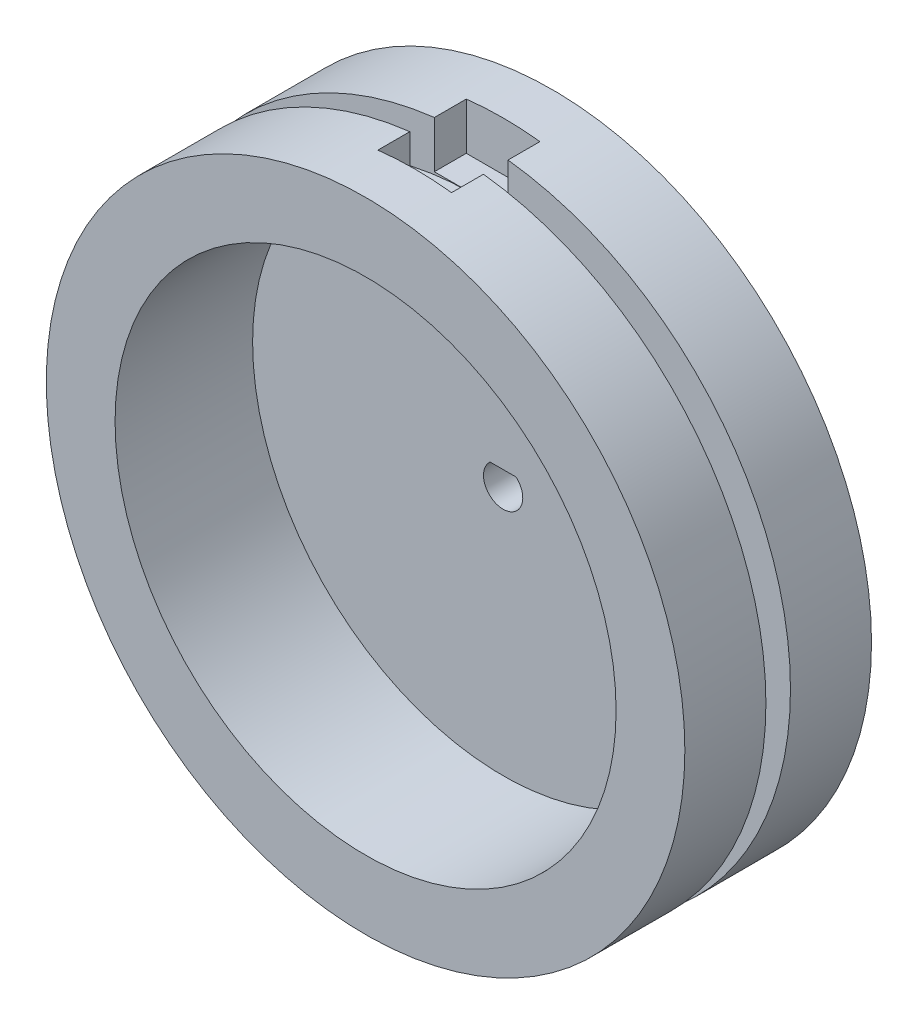
ISO-10303-21;
HEADER;
FILE_DESCRIPTION(('STEP AP214'),'2;1');
FILE_NAME('part.step','',(''),(''),'','','');
FILE_SCHEMA(('AUTOMOTIVE_DESIGN { 1 0 10303 214 1 1 1 1 }'));
ENDSEC;
DATA;
#1=APPLICATION_CONTEXT('core data for automotive mechanical design processes');
#2=APPLICATION_PROTOCOL_DEFINITION('international standard','automotive_design',2000,#1);
#3=PRODUCT_CONTEXT('',#1,'mechanical');
#4=PRODUCT('Part','Part','',(#3));
#5=PRODUCT_RELATED_PRODUCT_CATEGORY('part','',(#4));
#6=PRODUCT_DEFINITION_FORMATION('','',#4);
#7=PRODUCT_DEFINITION_CONTEXT('part definition',#1,'design');
#8=PRODUCT_DEFINITION('design','',#6,#7);
#9=PRODUCT_DEFINITION_SHAPE('','',#8);
#10=(LENGTH_UNIT() NAMED_UNIT(*) SI_UNIT(.MILLI.,.METRE.));
#11=(NAMED_UNIT(*) PLANE_ANGLE_UNIT() SI_UNIT($,.RADIAN.));
#12=(NAMED_UNIT(*) SI_UNIT($,.STERADIAN.) SOLID_ANGLE_UNIT());
#13=UNCERTAINTY_MEASURE_WITH_UNIT(LENGTH_MEASURE(1.E-05),#10,'distance_accuracy_value','');
#14=(GEOMETRIC_REPRESENTATION_CONTEXT(3) GLOBAL_UNCERTAINTY_ASSIGNED_CONTEXT((#13)) GLOBAL_UNIT_ASSIGNED_CONTEXT((#10,
#11,#12)) REPRESENTATION_CONTEXT('',''));
#15=CARTESIAN_POINT('',(0.,0.,0.));
#16=DIRECTION('',(0.,0.,1.));
#17=DIRECTION('',(1.,0.,0.));
#18=AXIS2_PLACEMENT_3D('',#15,#16,#17);
#19=CARTESIAN_POINT('',(0.,0.,5.));
#20=DIRECTION('',(0.,0.,1.));
#21=DIRECTION('',(1.,0.,0.));
#22=AXIS2_PLACEMENT_3D('',#19,#20,#21);
#23=CYLINDRICAL_SURFACE('',#22,32.5);
#24=CARTESIAN_POINT('',(0.,0.,0.));
#25=DIRECTION('',(0.,0.,1.));
#26=DIRECTION('',(1.,0.,0.));
#27=AXIS2_PLACEMENT_3D('',#24,#25,#26);
#28=CIRCLE('',#27,32.5);
#29=CARTESIAN_POINT('',(32.5,0.,0.));
#30=VERTEX_POINT('',#29);
#31=EDGE_CURVE('E304',#30,#30,#28,.T.);
#32=ORIENTED_EDGE('',*,*,#31,.T.);
#33=EDGE_LOOP('',(#32));
#34=FACE_BOUND('',#33,.T.);
#35=DIRECTION('',(0.,0.,1.));
#36=VECTOR('',#35,1.);
#37=CARTESIAN_POINT('',(-3.75,-32.2829289253624,5.));
#38=LINE('',#37,#36);
#39=CARTESIAN_POINT('',(-3.75,-32.2829289253624,8.25));
#40=VERTEX_POINT('',#39);
#41=CARTESIAN_POINT('',(-3.75,-32.2829289253624,5.));
#42=VERTEX_POINT('',#41);
#43=EDGE_CURVE('E226',#40,#42,#38,.F.);
#44=ORIENTED_EDGE('',*,*,#43,.F.);
#45=CARTESIAN_POINT('',(0.,0.,8.25));
#46=DIRECTION('',(0.,0.,1.));
#47=DIRECTION('',(1.,0.,0.));
#48=AXIS2_PLACEMENT_3D('',#45,#46,#47);
#49=CIRCLE('',#48,32.5);
#50=CARTESIAN_POINT('',(-3.75,32.2829289253624,8.25));
#51=VERTEX_POINT('',#50);
#52=EDGE_CURVE('E301',#51,#40,#49,.T.);
#53=ORIENTED_EDGE('',*,*,#52,.F.);
#54=DIRECTION('',(0.,0.,1.));
#55=VECTOR('',#54,1.);
#56=CARTESIAN_POINT('',(-3.75,32.2829289253624,5.));
#57=LINE('',#56,#55);
#58=CARTESIAN_POINT('',(-3.75,32.2829289253624,5.));
#59=VERTEX_POINT('',#58);
#60=EDGE_CURVE('E272',#51,#59,#57,.F.);
#61=ORIENTED_EDGE('',*,*,#60,.T.);
#62=CARTESIAN_POINT('',(0.,0.,5.));
#63=DIRECTION('',(0.,0.,-1.));
#64=DIRECTION('',(-1.,0.,0.));
#65=AXIS2_PLACEMENT_3D('',#62,#63,#64);
#66=CIRCLE('',#65,32.5);
#67=CARTESIAN_POINT('',(3.75,32.2829289253624,5.));
#68=VERTEX_POINT('',#67);
#69=EDGE_CURVE('E320',#59,#68,#66,.T.);
#70=ORIENTED_EDGE('',*,*,#69,.T.);
#71=DIRECTION('',(0.,0.,1.));
#72=VECTOR('',#71,1.);
#73=CARTESIAN_POINT('',(3.75,32.2829289253624,5.));
#74=LINE('',#73,#72);
#75=CARTESIAN_POINT('',(3.75,32.2829289253624,8.25));
#76=VERTEX_POINT('',#75);
#77=EDGE_CURVE('E263',#68,#76,#74,.T.);
#78=ORIENTED_EDGE('',*,*,#77,.T.);
#79=CARTESIAN_POINT('',(3.75,-32.2829289253624,8.25));
#80=VERTEX_POINT('',#79);
#81=EDGE_CURVE('E300',#80,#76,#49,.T.);
#82=ORIENTED_EDGE('',*,*,#81,.F.);
#83=DIRECTION('',(0.,0.,1.));
#84=VECTOR('',#83,1.);
#85=CARTESIAN_POINT('',(3.75,-32.2829289253624,5.));
#86=LINE('',#85,#84);
#87=CARTESIAN_POINT('',(3.75,-32.2829289253624,5.));
#88=VERTEX_POINT('',#87);
#89=EDGE_CURVE('E220',#88,#80,#86,.T.);
#90=ORIENTED_EDGE('',*,*,#89,.F.);
#91=CARTESIAN_POINT('',(0.,0.,5.));
#92=DIRECTION('',(0.,0.,1.));
#93=DIRECTION('',(1.,0.,0.));
#94=AXIS2_PLACEMENT_3D('',#91,#92,#93);
#95=CIRCLE('',#94,32.5);
#96=EDGE_CURVE('E334',#42,#88,#95,.T.);
#97=ORIENTED_EDGE('',*,*,#96,.F.);
#98=EDGE_LOOP('',(#44,#53,#61,#70,#78,#82,#90,#97));
#99=FACE_BOUND('',#98,.T.);
#100=ADVANCED_FACE('F43',(#34,#99),#23,.T.);
#101=CARTESIAN_POINT('',(0.,32.5,8.25));
#102=DIRECTION('',(0.,0.,-1.));
#103=DIRECTION('',(-1.,0.,0.));
#104=AXIS2_PLACEMENT_3D('',#101,#102,#103);
#105=PLANE('',#104);
#106=DIRECTION('',(0.,-1.,0.));
#107=VECTOR('',#106,1.);
#108=CARTESIAN_POINT('',(-3.75,32.5,8.25));
#109=LINE('',#108,#107);
#110=CARTESIAN_POINT('',(-3.75,-27.5,8.25));
#111=VERTEX_POINT('',#110);
#112=EDGE_CURVE('E224',#111,#40,#109,.T.);
#113=ORIENTED_EDGE('',*,*,#112,.F.);
#114=DIRECTION('',(1.,0.,0.));
#115=VECTOR('',#114,1.);
#116=CARTESIAN_POINT('',(0.,-27.5,8.25));
#117=LINE('',#116,#115);
#118=CARTESIAN_POINT('',(0.,-27.5,8.25));
#119=VERTEX_POINT('',#118);
#120=EDGE_CURVE('E232',#111,#119,#117,.T.);
#121=ORIENTED_EDGE('',*,*,#120,.T.);
#122=CARTESIAN_POINT('',(0.,0.,8.25));
#123=DIRECTION('',(0.,0.,1.));
#124=DIRECTION('',(1.,0.,0.));
#125=AXIS2_PLACEMENT_3D('',#122,#123,#124);
#126=CIRCLE('',#125,27.5);
#127=CARTESIAN_POINT('',(0.,27.5,8.25));
#128=VERTEX_POINT('',#127);
#129=EDGE_CURVE('E297',#128,#119,#126,.T.);
#130=ORIENTED_EDGE('',*,*,#129,.F.);
#131=DIRECTION('',(-1.,0.,0.));
#132=VECTOR('',#131,1.);
#133=CARTESIAN_POINT('',(0.,27.5,8.25));
#134=LINE('',#133,#132);
#135=CARTESIAN_POINT('',(-3.75,27.5,8.25));
#136=VERTEX_POINT('',#135);
#137=EDGE_CURVE('E275',#128,#136,#134,.T.);
#138=ORIENTED_EDGE('',*,*,#137,.T.);
#139=DIRECTION('',(0.,1.,0.));
#140=VECTOR('',#139,1.);
#141=CARTESIAN_POINT('',(-3.75,32.5,8.25));
#142=LINE('',#141,#140);
#143=EDGE_CURVE('E269',#136,#51,#142,.T.);
#144=ORIENTED_EDGE('',*,*,#143,.T.);
#145=ORIENTED_EDGE('',*,*,#52,.T.);
#146=EDGE_LOOP('',(#113,#121,#130,#138,#144,#145));
#147=FACE_BOUND('',#146,.T.);
#148=ADVANCED_FACE('F412',(#147),#105,.F.);
#149=DIRECTION('',(0.,1.,0.));
#150=VECTOR('',#149,1.);
#151=CARTESIAN_POINT('',(3.75,32.5,8.25));
#152=LINE('',#151,#150);
#153=CARTESIAN_POINT('',(3.75,-27.5,8.25));
#154=VERTEX_POINT('',#153);
#155=EDGE_CURVE('E217',#80,#154,#152,.T.);
#156=ORIENTED_EDGE('',*,*,#155,.F.);
#157=ORIENTED_EDGE('',*,*,#81,.T.);
#158=DIRECTION('',(0.,-1.,0.));
#159=VECTOR('',#158,1.);
#160=CARTESIAN_POINT('',(3.75,32.5,8.25));
#161=LINE('',#160,#159);
#162=CARTESIAN_POINT('',(3.75,27.5,8.25));
#163=VERTEX_POINT('',#162);
#164=EDGE_CURVE('E260',#76,#163,#161,.T.);
#165=ORIENTED_EDGE('',*,*,#164,.T.);
#166=EDGE_CURVE('E278',#163,#128,#134,.T.);
#167=ORIENTED_EDGE('',*,*,#166,.T.);
#168=EDGE_CURVE('E296',#119,#128,#126,.T.);
#169=ORIENTED_EDGE('',*,*,#168,.F.);
#170=EDGE_CURVE('E229',#119,#154,#117,.T.);
#171=ORIENTED_EDGE('',*,*,#170,.T.);
#172=EDGE_LOOP('',(#156,#157,#165,#167,#169,#171));
#173=FACE_BOUND('',#172,.T.);
#174=ADVANCED_FACE('F418',(#173),#105,.F.);
#175=CARTESIAN_POINT('',(0.,27.5,10.75));
#176=DIRECTION('',(0.,0.,1.));
#177=DIRECTION('',(1.,0.,0.));
#178=AXIS2_PLACEMENT_3D('',#175,#176,#177);
#179=PLANE('',#178);
#180=DIRECTION('',(0.,1.,0.));
#181=VECTOR('',#180,1.);
#182=CARTESIAN_POINT('',(-3.75,27.5,10.75));
#183=LINE('',#182,#181);
#184=CARTESIAN_POINT('',(-3.75,-32.2829289253624,10.75));
#185=VERTEX_POINT('',#184);
#186=CARTESIAN_POINT('',(-3.75,-27.5,10.75));
#187=VERTEX_POINT('',#186);
#188=EDGE_CURVE('E222',#185,#187,#183,.T.);
#189=ORIENTED_EDGE('',*,*,#188,.F.);
#190=CARTESIAN_POINT('',(0.,0.,10.75));
#191=DIRECTION('',(0.,0.,1.));
#192=DIRECTION('',(1.,0.,0.));
#193=AXIS2_PLACEMENT_3D('',#190,#191,#192);
#194=CIRCLE('',#193,32.5);
#195=CARTESIAN_POINT('',(-3.75,32.2829289253624,10.75));
#196=VERTEX_POINT('',#195);
#197=EDGE_CURVE('E289',#196,#185,#194,.T.);
#198=ORIENTED_EDGE('',*,*,#197,.F.);
#199=DIRECTION('',(0.,-1.,0.));
#200=VECTOR('',#199,1.);
#201=CARTESIAN_POINT('',(-3.75,27.5,10.75));
#202=LINE('',#201,#200);
#203=CARTESIAN_POINT('',(-3.75,27.5,10.75));
#204=VERTEX_POINT('',#203);
#205=EDGE_CURVE('E266',#196,#204,#202,.T.);
#206=ORIENTED_EDGE('',*,*,#205,.T.);
#207=DIRECTION('',(1.,0.,0.));
#208=VECTOR('',#207,1.);
#209=CARTESIAN_POINT('',(0.,27.5,10.75));
#210=LINE('',#209,#208);
#211=CARTESIAN_POINT('',(0.,27.5,10.75));
#212=VERTEX_POINT('',#211);
#213=EDGE_CURVE('E319',#204,#212,#210,.T.);
#214=ORIENTED_EDGE('',*,*,#213,.T.);
#215=CARTESIAN_POINT('',(0.,0.,10.75));
#216=DIRECTION('',(0.,0.,1.));
#217=DIRECTION('',(1.,0.,0.));
#218=AXIS2_PLACEMENT_3D('',#215,#216,#217);
#219=CIRCLE('',#218,27.5);
#220=CARTESIAN_POINT('',(0.,-27.5,10.75));
#221=VERTEX_POINT('',#220);
#222=EDGE_CURVE('E293',#212,#221,#219,.T.);
#223=ORIENTED_EDGE('',*,*,#222,.T.);
#224=DIRECTION('',(-1.,0.,0.));
#225=VECTOR('',#224,1.);
#226=CARTESIAN_POINT('',(0.,-27.5,10.75));
#227=LINE('',#226,#225);
#228=EDGE_CURVE('E330',#221,#187,#227,.T.);
#229=ORIENTED_EDGE('',*,*,#228,.T.);
#230=EDGE_LOOP('',(#189,#198,#206,#214,#223,#229));
#231=FACE_BOUND('',#230,.T.);
#232=ADVANCED_FACE('F391',(#231),#179,.F.);
#233=DIRECTION('',(0.,-1.,0.));
#234=VECTOR('',#233,1.);
#235=CARTESIAN_POINT('',(3.75,27.5,10.75));
#236=LINE('',#235,#234);
#237=CARTESIAN_POINT('',(3.75,-27.5,10.75));
#238=VERTEX_POINT('',#237);
#239=CARTESIAN_POINT('',(3.75,-32.2829289253624,10.75));
#240=VERTEX_POINT('',#239);
#241=EDGE_CURVE('E207',#238,#240,#236,.T.);
#242=ORIENTED_EDGE('',*,*,#241,.F.);
#243=EDGE_CURVE('E333',#238,#221,#227,.T.);
#244=ORIENTED_EDGE('',*,*,#243,.T.);
#245=EDGE_CURVE('E292',#221,#212,#219,.T.);
#246=ORIENTED_EDGE('',*,*,#245,.T.);
#247=CARTESIAN_POINT('',(3.75,27.5,10.75));
#248=VERTEX_POINT('',#247);
#249=EDGE_CURVE('E316',#212,#248,#210,.T.);
#250=ORIENTED_EDGE('',*,*,#249,.T.);
#251=DIRECTION('',(0.,1.,0.));
#252=VECTOR('',#251,1.);
#253=CARTESIAN_POINT('',(3.75,27.5,10.75));
#254=LINE('',#253,#252);
#255=CARTESIAN_POINT('',(3.75,32.2829289253624,10.75));
#256=VERTEX_POINT('',#255);
#257=EDGE_CURVE('E250',#248,#256,#254,.T.);
#258=ORIENTED_EDGE('',*,*,#257,.T.);
#259=EDGE_CURVE('E288',#240,#256,#194,.T.);
#260=ORIENTED_EDGE('',*,*,#259,.F.);
#261=EDGE_LOOP('',(#242,#244,#246,#250,#258,#260));
#262=FACE_BOUND('',#261,.T.);
#263=ADVANCED_FACE('F359',(#262),#179,.F.);
#264=CARTESIAN_POINT('',(0.,0.,5.));
#265=DIRECTION('',(0.,0.,1.));
#266=DIRECTION('',(1.,0.,0.));
#267=AXIS2_PLACEMENT_3D('',#264,#265,#266);
#268=CYLINDRICAL_SURFACE('',#267,32.5);
#269=CARTESIAN_POINT('',(0.,0.,19.));
#270=DIRECTION('',(0.,0.,1.));
#271=DIRECTION('',(1.,0.,0.));
#272=AXIS2_PLACEMENT_3D('',#269,#270,#271);
#273=CIRCLE('',#272,32.5);
#274=CARTESIAN_POINT('',(32.5,0.,19.));
#275=VERTEX_POINT('',#274);
#276=EDGE_CURVE('E285',#275,#275,#273,.T.);
#277=ORIENTED_EDGE('',*,*,#276,.F.);
#278=EDGE_LOOP('',(#277));
#279=FACE_BOUND('',#278,.T.);
#280=CARTESIAN_POINT('',(0.,0.,14.));
#281=DIRECTION('',(0.,0.,-1.));
#282=DIRECTION('',(-1.,0.,0.));
#283=AXIS2_PLACEMENT_3D('',#280,#281,#282);
#284=CIRCLE('',#283,32.5);
#285=CARTESIAN_POINT('',(3.75,-32.2829289253624,14.));
#286=VERTEX_POINT('',#285);
#287=CARTESIAN_POINT('',(-3.75,-32.2829289253624,14.));
#288=VERTEX_POINT('',#287);
#289=EDGE_CURVE('E323',#286,#288,#284,.T.);
#290=ORIENTED_EDGE('',*,*,#289,.F.);
#291=DIRECTION('',(0.,0.,1.));
#292=VECTOR('',#291,1.);
#293=CARTESIAN_POINT('',(3.75,-32.2829289253624,5.));
#294=LINE('',#293,#292);
#295=EDGE_CURVE('E327',#240,#286,#294,.T.);
#296=ORIENTED_EDGE('',*,*,#295,.F.);
#297=ORIENTED_EDGE('',*,*,#259,.T.);
#298=DIRECTION('',(0.,0.,1.));
#299=VECTOR('',#298,1.);
#300=CARTESIAN_POINT('',(3.75,32.2829289253624,5.));
#301=LINE('',#300,#299);
#302=CARTESIAN_POINT('',(3.75,32.2829289253624,14.));
#303=VERTEX_POINT('',#302);
#304=EDGE_CURVE('E313',#256,#303,#301,.T.);
#305=ORIENTED_EDGE('',*,*,#304,.T.);
#306=CARTESIAN_POINT('',(0.,0.,14.));
#307=DIRECTION('',(0.,0.,1.));
#308=DIRECTION('',(1.,0.,0.));
#309=AXIS2_PLACEMENT_3D('',#306,#307,#308);
#310=CIRCLE('',#309,32.5);
#311=CARTESIAN_POINT('',(-3.75,32.2829289253624,14.));
#312=VERTEX_POINT('',#311);
#313=EDGE_CURVE('E307',#303,#312,#310,.T.);
#314=ORIENTED_EDGE('',*,*,#313,.T.);
#315=DIRECTION('',(0.,0.,1.));
#316=VECTOR('',#315,1.);
#317=CARTESIAN_POINT('',(-3.75,32.2829289253624,5.));
#318=LINE('',#317,#316);
#319=EDGE_CURVE('E310',#312,#196,#318,.F.);
#320=ORIENTED_EDGE('',*,*,#319,.T.);
#321=ORIENTED_EDGE('',*,*,#197,.T.);
#322=DIRECTION('',(0.,0.,1.));
#323=VECTOR('',#322,1.);
#324=CARTESIAN_POINT('',(-3.75,-32.2829289253624,5.));
#325=LINE('',#324,#323);
#326=EDGE_CURVE('E325',#288,#185,#325,.F.);
#327=ORIENTED_EDGE('',*,*,#326,.F.);
#328=EDGE_LOOP('',(#290,#296,#297,#305,#314,#320,#321,#327));
#329=FACE_BOUND('',#328,.T.);
#330=ADVANCED_FACE('F356',(#279,#329),#268,.T.);
#331=CARTESIAN_POINT('',(0.,0.,0.));
#332=DIRECTION('',(0.,0.,1.));
#333=DIRECTION('',(1.,0.,0.));
#334=AXIS2_PLACEMENT_3D('',#331,#332,#333);
#335=PLANE('',#334);
#336=DIRECTION('',(1.,0.,0.));
#337=VECTOR('',#336,1.);
#338=CARTESIAN_POINT('',(1.3228756555323,1.5,0.));
#339=LINE('',#338,#337);
#340=CARTESIAN_POINT('',(-1.3228756555323,1.5,0.));
#341=VERTEX_POINT('',#340);
#342=CARTESIAN_POINT('',(1.3228756555323,1.5,0.));
#343=VERTEX_POINT('',#342);
#344=EDGE_CURVE('E184',#341,#343,#339,.T.);
#345=ORIENTED_EDGE('',*,*,#344,.F.);
#346=CARTESIAN_POINT('',(0.,0.,0.));
#347=DIRECTION('',(0.,0.,-1.));
#348=DIRECTION('',(-1.,0.,0.));
#349=AXIS2_PLACEMENT_3D('',#346,#347,#348);
#350=CIRCLE('',#349,2.);
#351=EDGE_CURVE('E58',#343,#341,#350,.T.);
#352=ORIENTED_EDGE('',*,*,#351,.F.);
#353=EDGE_LOOP('',(#345,#352));
#354=FACE_BOUND('',#353,.T.);
#355=ORIENTED_EDGE('',*,*,#31,.F.);
#356=EDGE_LOOP('',(#355));
#357=FACE_BOUND('',#356,.T.);
#358=ADVANCED_FACE('F45',(#354,#357),#335,.F.);
#359=CARTESIAN_POINT('',(0.,0.,5.));
#360=DIRECTION('',(0.,0.,1.));
#361=DIRECTION('',(1.,0.,0.));
#362=AXIS2_PLACEMENT_3D('',#359,#360,#361);
#363=CYLINDRICAL_SURFACE('',#362,27.5);
#364=ORIENTED_EDGE('',*,*,#245,.F.);
#365=ORIENTED_EDGE('',*,*,#222,.F.);
#366=EDGE_LOOP('',(#364,#365));
#367=FACE_BOUND('',#366,.T.);
#368=ORIENTED_EDGE('',*,*,#129,.T.);
#369=ORIENTED_EDGE('',*,*,#168,.T.);
#370=EDGE_LOOP('',(#368,#369));
#371=FACE_BOUND('',#370,.T.);
#372=ADVANCED_FACE('F352',(#367,#371),#363,.T.);
#373=CARTESIAN_POINT('',(0.,32.5,19.));
#374=DIRECTION('',(0.,0.,-1.));
#375=DIRECTION('',(-1.,0.,0.));
#376=AXIS2_PLACEMENT_3D('',#373,#374,#375);
#377=PLANE('',#376);
#378=CARTESIAN_POINT('',(0.,0.,19.));
#379=DIRECTION('',(0.,0.,1.));
#380=DIRECTION('',(1.,0.,0.));
#381=AXIS2_PLACEMENT_3D('',#378,#379,#380);
#382=CIRCLE('',#381,25.5);
#383=CARTESIAN_POINT('',(25.5,0.,19.));
#384=VERTEX_POINT('',#383);
#385=EDGE_CURVE('E282',#384,#384,#382,.T.);
#386=ORIENTED_EDGE('',*,*,#385,.F.);
#387=EDGE_LOOP('',(#386));
#388=FACE_BOUND('',#387,.T.);
#389=ORIENTED_EDGE('',*,*,#276,.T.);
#390=EDGE_LOOP('',(#389));
#391=FACE_BOUND('',#390,.T.);
#392=ADVANCED_FACE('F346',(#388,#391),#377,.F.);
#393=CARTESIAN_POINT('',(0.,0.,5.));
#394=DIRECTION('',(0.,0.,1.));
#395=DIRECTION('',(1.,0.,0.));
#396=AXIS2_PLACEMENT_3D('',#393,#394,#395);
#397=CYLINDRICAL_SURFACE('',#396,25.5);
#398=CARTESIAN_POINT('',(0.,0.,5.));
#399=DIRECTION('',(0.,0.,1.));
#400=DIRECTION('',(1.,0.,0.));
#401=AXIS2_PLACEMENT_3D('',#398,#399,#400);
#402=CIRCLE('',#401,25.5);
#403=CARTESIAN_POINT('',(25.5,0.,5.));
#404=VERTEX_POINT('',#403);
#405=EDGE_CURVE('E279',#404,#404,#402,.T.);
#406=ORIENTED_EDGE('',*,*,#405,.F.);
#407=EDGE_LOOP('',(#406));
#408=FACE_BOUND('',#407,.T.);
#409=ORIENTED_EDGE('',*,*,#385,.T.);
#410=EDGE_LOOP('',(#409));
#411=FACE_BOUND('',#410,.T.);
#412=ADVANCED_FACE('F340',(#408,#411),#397,.F.);
#413=CARTESIAN_POINT('',(0.,25.5,5.));
#414=DIRECTION('',(0.,0.,-1.));
#415=DIRECTION('',(-1.,0.,0.));
#416=AXIS2_PLACEMENT_3D('',#413,#414,#415);
#417=PLANE('',#416);
#418=DIRECTION('',(1.,0.,0.));
#419=VECTOR('',#418,1.);
#420=CARTESIAN_POINT('',(0.,1.5,5.));
#421=LINE('',#420,#419);
#422=CARTESIAN_POINT('',(-1.3228756555323,1.5,5.));
#423=VERTEX_POINT('',#422);
#424=CARTESIAN_POINT('',(1.3228756555323,1.5,5.));
#425=VERTEX_POINT('',#424);
#426=EDGE_CURVE('E51',#423,#425,#421,.T.);
#427=ORIENTED_EDGE('',*,*,#426,.T.);
#428=CARTESIAN_POINT('',(0.,0.,5.));
#429=DIRECTION('',(0.,0.,-1.));
#430=DIRECTION('',(-1.,0.,0.));
#431=AXIS2_PLACEMENT_3D('',#428,#429,#430);
#432=CIRCLE('',#431,2.);
#433=EDGE_CURVE('E11',#425,#423,#432,.T.);
#434=ORIENTED_EDGE('',*,*,#433,.T.);
#435=EDGE_LOOP('',(#427,#434));
#436=FACE_BOUND('',#435,.T.);
#437=ORIENTED_EDGE('',*,*,#405,.T.);
#438=EDGE_LOOP('',(#437));
#439=FACE_BOUND('',#438,.T.);
#440=ADVANCED_FACE('F336',(#436,#439),#417,.F.);
#441=CARTESIAN_POINT('',(-3.75,27.5,14.));
#442=DIRECTION('',(0.,0.,1.));
#443=DIRECTION('',(1.,0.,0.));
#444=AXIS2_PLACEMENT_3D('',#441,#442,#443);
#445=PLANE('',#444);
#446=DIRECTION('',(0.,1.,0.));
#447=VECTOR('',#446,1.);
#448=CARTESIAN_POINT('',(3.75,27.5,14.));
#449=LINE('',#448,#447);
#450=CARTESIAN_POINT('',(3.75,27.5,14.));
#451=VERTEX_POINT('',#450);
#452=EDGE_CURVE('E254',#451,#303,#449,.T.);
#453=ORIENTED_EDGE('',*,*,#452,.F.);
#454=DIRECTION('',(1.,0.,0.));
#455=VECTOR('',#454,1.);
#456=CARTESIAN_POINT('',(-3.75,27.5,14.));
#457=LINE('',#456,#455);
#458=CARTESIAN_POINT('',(-3.75,27.5,14.));
#459=VERTEX_POINT('',#458);
#460=EDGE_CURVE('E235',#459,#451,#457,.T.);
#461=ORIENTED_EDGE('',*,*,#460,.F.);
#462=DIRECTION('',(0.,1.,0.));
#463=VECTOR('',#462,1.);
#464=CARTESIAN_POINT('',(-3.75,27.5,14.));
#465=LINE('',#464,#463);
#466=EDGE_CURVE('E246',#459,#312,#465,.T.);
#467=ORIENTED_EDGE('',*,*,#466,.T.);
#468=ORIENTED_EDGE('',*,*,#313,.F.);
#469=EDGE_LOOP('',(#453,#461,#467,#468));
#470=FACE_BOUND('',#469,.T.);
#471=ADVANCED_FACE('F339',(#470),#445,.F.);
#472=CARTESIAN_POINT('',(3.75,27.5,14.));
#473=DIRECTION('',(1.,0.,0.));
#474=DIRECTION('',(0.,0.,-1.));
#475=AXIS2_PLACEMENT_3D('',#472,#473,#474);
#476=PLANE('',#475);
#477=DIRECTION('',(0.,0.,-1.));
#478=VECTOR('',#477,1.);
#479=CARTESIAN_POINT('',(3.75,27.5,14.));
#480=LINE('',#479,#478);
#481=EDGE_CURVE('E240',#451,#248,#480,.T.);
#482=ORIENTED_EDGE('',*,*,#481,.F.);
#483=ORIENTED_EDGE('',*,*,#452,.T.);
#484=ORIENTED_EDGE('',*,*,#304,.F.);
#485=ORIENTED_EDGE('',*,*,#257,.F.);
#486=EDGE_LOOP('',(#482,#483,#484,#485));
#487=FACE_BOUND('',#486,.T.);
#488=ADVANCED_FACE('F382',(#487),#476,.F.);
#489=CARTESIAN_POINT('',(-3.75,27.5,14.));
#490=DIRECTION('',(-1.,0.,0.));
#491=DIRECTION('',(0.,0.,1.));
#492=AXIS2_PLACEMENT_3D('',#489,#490,#491);
#493=PLANE('',#492);
#494=ORIENTED_EDGE('',*,*,#319,.F.);
#495=ORIENTED_EDGE('',*,*,#466,.F.);
#496=DIRECTION('',(0.,0.,1.));
#497=VECTOR('',#496,1.);
#498=CARTESIAN_POINT('',(-3.75,27.5,14.));
#499=LINE('',#498,#497);
#500=EDGE_CURVE('E236',#204,#459,#499,.T.);
#501=ORIENTED_EDGE('',*,*,#500,.F.);
#502=ORIENTED_EDGE('',*,*,#205,.F.);
#503=EDGE_LOOP('',(#494,#495,#501,#502));
#504=FACE_BOUND('',#503,.T.);
#505=ADVANCED_FACE('F434',(#504),#493,.F.);
#506=CARTESIAN_POINT('',(0.,27.5,0.));
#507=DIRECTION('',(0.,-1.,0.));
#508=DIRECTION('',(0.,0.,-1.));
#509=AXIS2_PLACEMENT_3D('',#506,#507,#508);
#510=PLANE('',#509);
#511=ORIENTED_EDGE('',*,*,#500,.T.);
#512=ORIENTED_EDGE('',*,*,#460,.T.);
#513=ORIENTED_EDGE('',*,*,#481,.T.);
#514=ORIENTED_EDGE('',*,*,#249,.F.);
#515=ORIENTED_EDGE('',*,*,#213,.F.);
#516=EDGE_LOOP('',(#511,#512,#513,#514,#515));
#517=FACE_BOUND('',#516,.T.);
#518=ADVANCED_FACE('F441',(#517),#510,.F.);
#519=CARTESIAN_POINT('',(-3.75,27.5,5.));
#520=DIRECTION('',(0.,0.,-1.));
#521=DIRECTION('',(-1.,0.,0.));
#522=AXIS2_PLACEMENT_3D('',#519,#520,#521);
#523=PLANE('',#522);
#524=DIRECTION('',(0.,1.,0.));
#525=VECTOR('',#524,1.);
#526=CARTESIAN_POINT('',(-3.75,27.5,5.));
#527=LINE('',#526,#525);
#528=CARTESIAN_POINT('',(-3.75,27.5,5.));
#529=VERTEX_POINT('',#528);
#530=EDGE_CURVE('E247',#529,#59,#527,.T.);
#531=ORIENTED_EDGE('',*,*,#530,.F.);
#532=DIRECTION('',(-1.,0.,0.));
#533=VECTOR('',#532,1.);
#534=CARTESIAN_POINT('',(-3.75,27.5,5.));
#535=LINE('',#534,#533);
#536=CARTESIAN_POINT('',(3.75,27.5,5.));
#537=VERTEX_POINT('',#536);
#538=EDGE_CURVE('E243',#537,#529,#535,.T.);
#539=ORIENTED_EDGE('',*,*,#538,.F.);
#540=DIRECTION('',(0.,1.,0.));
#541=VECTOR('',#540,1.);
#542=CARTESIAN_POINT('',(3.75,27.5,5.));
#543=LINE('',#542,#541);
#544=EDGE_CURVE('E251',#537,#68,#543,.T.);
#545=ORIENTED_EDGE('',*,*,#544,.T.);
#546=ORIENTED_EDGE('',*,*,#69,.F.);
#547=EDGE_LOOP('',(#531,#539,#545,#546));
#548=FACE_BOUND('',#547,.T.);
#549=ADVANCED_FACE('F439',(#548),#523,.F.);
#550=EDGE_CURVE('E239',#163,#537,#480,.T.);
#551=ORIENTED_EDGE('',*,*,#550,.T.);
#552=ORIENTED_EDGE('',*,*,#538,.T.);
#553=EDGE_CURVE('E233',#529,#136,#499,.T.);
#554=ORIENTED_EDGE('',*,*,#553,.T.);
#555=ORIENTED_EDGE('',*,*,#137,.F.);
#556=ORIENTED_EDGE('',*,*,#166,.F.);
#557=EDGE_LOOP('',(#551,#552,#554,#555,#556));
#558=FACE_BOUND('',#557,.T.);
#559=ADVANCED_FACE('F432',(#558),#510,.F.);
#560=ORIENTED_EDGE('',*,*,#143,.F.);
#561=ORIENTED_EDGE('',*,*,#553,.F.);
#562=ORIENTED_EDGE('',*,*,#530,.T.);
#563=ORIENTED_EDGE('',*,*,#60,.F.);
#564=EDGE_LOOP('',(#560,#561,#562,#563));
#565=FACE_BOUND('',#564,.T.);
#566=ADVANCED_FACE('F428',(#565),#493,.F.);
#567=ORIENTED_EDGE('',*,*,#544,.F.);
#568=ORIENTED_EDGE('',*,*,#550,.F.);
#569=ORIENTED_EDGE('',*,*,#164,.F.);
#570=ORIENTED_EDGE('',*,*,#77,.F.);
#571=EDGE_LOOP('',(#567,#568,#569,#570));
#572=FACE_BOUND('',#571,.T.);
#573=ADVANCED_FACE('F431',(#572),#476,.F.);
#574=CARTESIAN_POINT('',(3.75,-27.5,14.));
#575=DIRECTION('',(-1.,0.,0.));
#576=DIRECTION('',(0.,0.,1.));
#577=AXIS2_PLACEMENT_3D('',#574,#575,#576);
#578=PLANE('',#577);
#579=ORIENTED_EDGE('',*,*,#241,.T.);
#580=ORIENTED_EDGE('',*,*,#295,.T.);
#581=DIRECTION('',(0.,-1.,0.));
#582=VECTOR('',#581,1.);
#583=CARTESIAN_POINT('',(3.75,-27.5,14.));
#584=LINE('',#583,#582);
#585=CARTESIAN_POINT('',(3.75,-27.5,14.));
#586=VERTEX_POINT('',#585);
#587=EDGE_CURVE('E208',#586,#286,#584,.T.);
#588=ORIENTED_EDGE('',*,*,#587,.F.);
#589=DIRECTION('',(0.,0.,-1.));
#590=VECTOR('',#589,1.);
#591=CARTESIAN_POINT('',(3.75,-27.5,14.));
#592=LINE('',#591,#590);
#593=EDGE_CURVE('E198',#586,#238,#592,.T.);
#594=ORIENTED_EDGE('',*,*,#593,.T.);
#595=EDGE_LOOP('',(#579,#580,#588,#594));
#596=FACE_BOUND('',#595,.T.);
#597=ADVANCED_FACE('F368',(#596),#578,.T.);
#598=CARTESIAN_POINT('',(-3.75,-27.5,14.));
#599=DIRECTION('',(0.,0.,-1.));
#600=DIRECTION('',(-1.,0.,0.));
#601=AXIS2_PLACEMENT_3D('',#598,#599,#600);
#602=PLANE('',#601);
#603=ORIENTED_EDGE('',*,*,#587,.T.);
#604=ORIENTED_EDGE('',*,*,#289,.T.);
#605=DIRECTION('',(0.,-1.,0.));
#606=VECTOR('',#605,1.);
#607=CARTESIAN_POINT('',(-3.75,-27.5,14.));
#608=LINE('',#607,#606);
#609=CARTESIAN_POINT('',(-3.75,-27.5,14.));
#610=VERTEX_POINT('',#609);
#611=EDGE_CURVE('E204',#610,#288,#608,.T.);
#612=ORIENTED_EDGE('',*,*,#611,.F.);
#613=DIRECTION('',(1.,0.,0.));
#614=VECTOR('',#613,1.);
#615=CARTESIAN_POINT('',(-3.75,-27.5,14.));
#616=LINE('',#615,#614);
#617=EDGE_CURVE('E201',#610,#586,#616,.T.);
#618=ORIENTED_EDGE('',*,*,#617,.T.);
#619=EDGE_LOOP('',(#603,#604,#612,#618));
#620=FACE_BOUND('',#619,.T.);
#621=ADVANCED_FACE('F371',(#620),#602,.T.);
#622=CARTESIAN_POINT('',(-3.75,-27.5,14.));
#623=DIRECTION('',(1.,0.,0.));
#624=DIRECTION('',(0.,0.,-1.));
#625=AXIS2_PLACEMENT_3D('',#622,#623,#624);
#626=PLANE('',#625);
#627=ORIENTED_EDGE('',*,*,#188,.T.);
#628=DIRECTION('',(0.,0.,1.));
#629=VECTOR('',#628,1.);
#630=CARTESIAN_POINT('',(-3.75,-27.5,14.));
#631=LINE('',#630,#629);
#632=EDGE_CURVE('E180',#187,#610,#631,.T.);
#633=ORIENTED_EDGE('',*,*,#632,.T.);
#634=ORIENTED_EDGE('',*,*,#611,.T.);
#635=ORIENTED_EDGE('',*,*,#326,.T.);
#636=EDGE_LOOP('',(#627,#633,#634,#635));
#637=FACE_BOUND('',#636,.T.);
#638=ADVANCED_FACE('F394',(#637),#626,.T.);
#639=CARTESIAN_POINT('',(0.,-27.5,0.));
#640=DIRECTION('',(0.,1.,0.));
#641=DIRECTION('',(0.,0.,-1.));
#642=AXIS2_PLACEMENT_3D('',#639,#640,#641);
#643=PLANE('',#642);
#644=ORIENTED_EDGE('',*,*,#593,.F.);
#645=ORIENTED_EDGE('',*,*,#617,.F.);
#646=ORIENTED_EDGE('',*,*,#632,.F.);
#647=ORIENTED_EDGE('',*,*,#228,.F.);
#648=ORIENTED_EDGE('',*,*,#243,.F.);
#649=EDGE_LOOP('',(#644,#645,#646,#647,#648));
#650=FACE_BOUND('',#649,.T.);
#651=ADVANCED_FACE('F375',(#650),#643,.F.);
#652=CARTESIAN_POINT('',(-3.75,-27.5,5.));
#653=DIRECTION('',(0.,0.,1.));
#654=DIRECTION('',(1.,0.,0.));
#655=AXIS2_PLACEMENT_3D('',#652,#653,#654);
#656=PLANE('',#655);
#657=DIRECTION('',(0.,-1.,0.));
#658=VECTOR('',#657,1.);
#659=CARTESIAN_POINT('',(-3.75,-27.5,5.));
#660=LINE('',#659,#658);
#661=CARTESIAN_POINT('',(-3.75,-27.5,5.));
#662=VERTEX_POINT('',#661);
#663=EDGE_CURVE('E203',#662,#42,#660,.T.);
#664=ORIENTED_EDGE('',*,*,#663,.T.);
#665=ORIENTED_EDGE('',*,*,#96,.T.);
#666=DIRECTION('',(0.,-1.,0.));
#667=VECTOR('',#666,1.);
#668=CARTESIAN_POINT('',(3.75,-27.5,5.));
#669=LINE('',#668,#667);
#670=CARTESIAN_POINT('',(3.75,-27.5,5.));
#671=VERTEX_POINT('',#670);
#672=EDGE_CURVE('E211',#671,#88,#669,.T.);
#673=ORIENTED_EDGE('',*,*,#672,.F.);
#674=DIRECTION('',(-1.,0.,0.));
#675=VECTOR('',#674,1.);
#676=CARTESIAN_POINT('',(-3.75,-27.5,5.));
#677=LINE('',#676,#675);
#678=EDGE_CURVE('E195',#671,#662,#677,.T.);
#679=ORIENTED_EDGE('',*,*,#678,.T.);
#680=EDGE_LOOP('',(#664,#665,#673,#679));
#681=FACE_BOUND('',#680,.T.);
#682=ADVANCED_FACE('F402',(#681),#656,.T.);
#683=EDGE_CURVE('E192',#662,#111,#631,.T.);
#684=ORIENTED_EDGE('',*,*,#683,.F.);
#685=ORIENTED_EDGE('',*,*,#678,.F.);
#686=EDGE_CURVE('E197',#154,#671,#592,.T.);
#687=ORIENTED_EDGE('',*,*,#686,.F.);
#688=ORIENTED_EDGE('',*,*,#170,.F.);
#689=ORIENTED_EDGE('',*,*,#120,.F.);
#690=EDGE_LOOP('',(#684,#685,#687,#688,#689));
#691=FACE_BOUND('',#690,.T.);
#692=ADVANCED_FACE('F404',(#691),#643,.F.);
#693=ORIENTED_EDGE('',*,*,#43,.T.);
#694=ORIENTED_EDGE('',*,*,#663,.F.);
#695=ORIENTED_EDGE('',*,*,#683,.T.);
#696=ORIENTED_EDGE('',*,*,#112,.T.);
#697=EDGE_LOOP('',(#693,#694,#695,#696));
#698=FACE_BOUND('',#697,.T.);
#699=ADVANCED_FACE('F397',(#698),#626,.T.);
#700=ORIENTED_EDGE('',*,*,#89,.T.);
#701=ORIENTED_EDGE('',*,*,#155,.T.);
#702=ORIENTED_EDGE('',*,*,#686,.T.);
#703=ORIENTED_EDGE('',*,*,#672,.T.);
#704=EDGE_LOOP('',(#700,#701,#702,#703));
#705=FACE_BOUND('',#704,.T.);
#706=ADVANCED_FACE('F409',(#705),#578,.T.);
#707=CARTESIAN_POINT('',(0.,0.,19.));
#708=DIRECTION('',(0.,0.,-1.));
#709=DIRECTION('',(-1.,0.,0.));
#710=AXIS2_PLACEMENT_3D('',#707,#708,#709);
#711=CYLINDRICAL_SURFACE('',#710,2.);
#712=DIRECTION('',(0.,0.,-1.));
#713=VECTOR('',#712,1.);
#714=CARTESIAN_POINT('',(1.3228756555323,1.5,19.));
#715=LINE('',#714,#713);
#716=EDGE_CURVE('E65',#425,#343,#715,.T.);
#717=ORIENTED_EDGE('',*,*,#716,.T.);
#718=ORIENTED_EDGE('',*,*,#351,.T.);
#719=DIRECTION('',(0.,0.,-1.));
#720=VECTOR('',#719,1.);
#721=CARTESIAN_POINT('',(-1.3228756555323,1.5,19.));
#722=LINE('',#721,#720);
#723=EDGE_CURVE('E181',#423,#341,#722,.T.);
#724=ORIENTED_EDGE('',*,*,#723,.F.);
#725=ORIENTED_EDGE('',*,*,#433,.F.);
#726=EDGE_LOOP('',(#717,#718,#724,#725));
#727=FACE_BOUND('',#726,.T.);
#728=ADVANCED_FACE('F178',(#727),#711,.F.);
#729=CARTESIAN_POINT('',(1.3228756555323,1.5,19.));
#730=DIRECTION('',(0.,1.,0.));
#731=DIRECTION('',(0.,0.,1.));
#732=AXIS2_PLACEMENT_3D('',#729,#730,#731);
#733=PLANE('',#732);
#734=ORIENTED_EDGE('',*,*,#723,.T.);
#735=ORIENTED_EDGE('',*,*,#344,.T.);
#736=ORIENTED_EDGE('',*,*,#716,.F.);
#737=ORIENTED_EDGE('',*,*,#426,.F.);
#738=EDGE_LOOP('',(#734,#735,#736,#737));
#739=FACE_BOUND('',#738,.T.);
#740=ADVANCED_FACE('F185',(#739),#733,.F.);
#741=CLOSED_SHELL('',(#100,#148,#174,#232,#263,#330,#358,#372,#392,#412,#440,#471,#488,#505,
#518,#549,#559,#566,#573,#597,#621,#638,#651,#682,#692,#699,#706,#728,#740));
#742=MANIFOLD_SOLID_BREP('B2',#741);
#743=ADVANCED_BREP_SHAPE_REPRESENTATION('',(#18,#742),#14);
#744=SHAPE_DEFINITION_REPRESENTATION(#9,#743);
ENDSEC;
END-ISO-10303-21;
